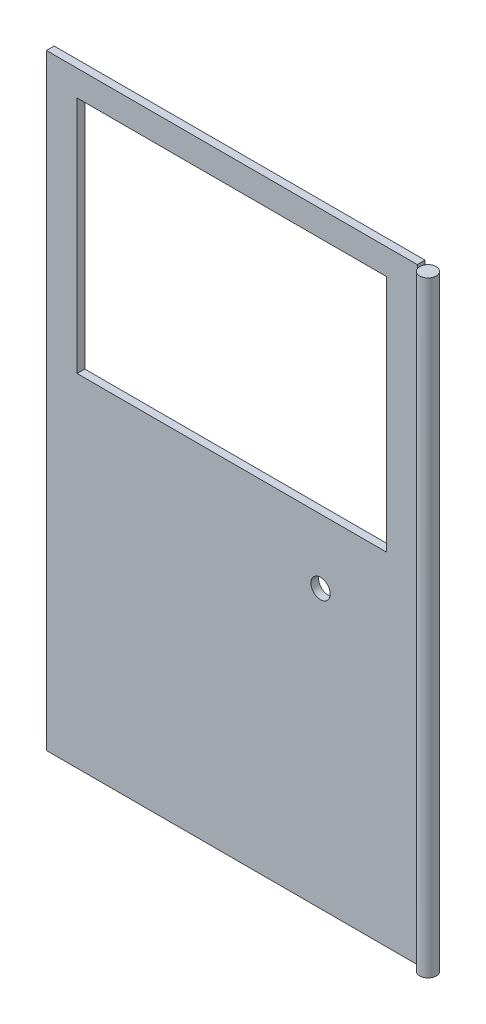
ISO-10303-21;
HEADER;
FILE_DESCRIPTION(('STEP AP214'),'2;1');
FILE_NAME('part.step','',(''),(''),'','','');
FILE_SCHEMA(('AUTOMOTIVE_DESIGN { 1 0 10303 214 1 1 1 1 }'));
ENDSEC;
DATA;
#1=APPLICATION_CONTEXT('core data for automotive mechanical design processes');
#2=APPLICATION_PROTOCOL_DEFINITION('international standard','automotive_design',2000,#1);
#3=PRODUCT_CONTEXT('',#1,'mechanical');
#4=PRODUCT('Part','Part','',(#3));
#5=PRODUCT_RELATED_PRODUCT_CATEGORY('part','',(#4));
#6=PRODUCT_DEFINITION_FORMATION('','',#4);
#7=PRODUCT_DEFINITION_CONTEXT('part definition',#1,'design');
#8=PRODUCT_DEFINITION('design','',#6,#7);
#9=PRODUCT_DEFINITION_SHAPE('','',#8);
#10=(LENGTH_UNIT() NAMED_UNIT(*) SI_UNIT(.MILLI.,.METRE.));
#11=(NAMED_UNIT(*) PLANE_ANGLE_UNIT() SI_UNIT($,.RADIAN.));
#12=(NAMED_UNIT(*) SI_UNIT($,.STERADIAN.) SOLID_ANGLE_UNIT());
#13=UNCERTAINTY_MEASURE_WITH_UNIT(LENGTH_MEASURE(1.E-05),#10,'distance_accuracy_value','');
#14=(GEOMETRIC_REPRESENTATION_CONTEXT(3) GLOBAL_UNCERTAINTY_ASSIGNED_CONTEXT((#13)) GLOBAL_UNIT_ASSIGNED_CONTEXT((#10,
#11,#12)) REPRESENTATION_CONTEXT('',''));
#15=CARTESIAN_POINT('',(0.,0.,0.));
#16=DIRECTION('',(0.,0.,1.));
#17=DIRECTION('',(1.,0.,0.));
#18=AXIS2_PLACEMENT_3D('',#15,#16,#17);
#19=CARTESIAN_POINT('',(304.8,505.921024484277,12.7));
#20=DIRECTION('',(0.,-1.,0.));
#21=DIRECTION('',(0.,0.,-1.));
#22=AXIS2_PLACEMENT_3D('',#19,#20,#21);
#23=CYLINDRICAL_SURFACE('',#22,12.7);
#24=CARTESIAN_POINT('',(304.8,470.,12.7));
#25=DIRECTION('',(0.,-1.,0.));
#26=DIRECTION('',(0.,0.,-1.));
#27=AXIS2_PLACEMENT_3D('',#24,#25,#26);
#28=CIRCLE('',#27,12.7);
#29=CARTESIAN_POINT('',(304.8,470.,0.));
#30=VERTEX_POINT('',#29);
#31=EDGE_CURVE('E11',#30,#30,#28,.T.);
#32=ORIENTED_EDGE('',*,*,#31,.T.);
#33=EDGE_LOOP('',(#32));
#34=FACE_BOUND('',#33,.T.);
#35=CARTESIAN_POINT('',(304.8,-470.,12.7));
#36=DIRECTION('',(0.,1.,0.));
#37=DIRECTION('',(0.,0.,1.));
#38=AXIS2_PLACEMENT_3D('',#35,#36,#37);
#39=CIRCLE('',#38,12.7);
#40=CARTESIAN_POINT('',(304.8,-470.,25.4));
#41=VERTEX_POINT('',#40);
#42=EDGE_CURVE('E47',#41,#41,#39,.F.);
#43=ORIENTED_EDGE('',*,*,#42,.F.);
#44=EDGE_LOOP('',(#43));
#45=FACE_BOUND('',#44,.T.);
#46=ADVANCED_FACE('F41',(#34,#45),#23,.T.);
#47=CARTESIAN_POINT('',(-287.5,470.,12.));
#48=DIRECTION('',(0.,-1.,0.));
#49=DIRECTION('',(0.,0.,-1.));
#50=AXIS2_PLACEMENT_3D('',#47,#48,#49);
#51=PLANE('',#50);
#52=ORIENTED_EDGE('',*,*,#31,.F.);
#53=EDGE_LOOP('',(#52));
#54=FACE_BOUND('',#53,.T.);
#55=ADVANCED_FACE('F56',(#54),#51,.F.);
#56=CARTESIAN_POINT('',(-287.5,-470.,12.));
#57=DIRECTION('',(0.,1.,0.));
#58=DIRECTION('',(0.,0.,1.));
#59=AXIS2_PLACEMENT_3D('',#56,#57,#58);
#60=PLANE('',#59);
#61=ORIENTED_EDGE('',*,*,#42,.T.);
#62=EDGE_LOOP('',(#61));
#63=FACE_BOUND('',#62,.T.);
#64=ADVANCED_FACE('F53',(#63),#60,.F.);
#65=CLOSED_SHELL('',(#46,#55,#64));
#66=MANIFOLD_SOLID_BREP('B2',#65);
#67=CARTESIAN_POINT('',(0.,0.,12.));
#68=DIRECTION('',(0.,0.,1.));
#69=DIRECTION('',(1.,0.,0.));
#70=AXIS2_PLACEMENT_3D('',#67,#68,#69);
#71=PLANE('',#70);
#72=CARTESIAN_POINT('',(137.5,-39.9999999999998,12.));
#73=DIRECTION('',(0.,0.,1.));
#74=DIRECTION('',(1.,0.,0.));
#75=AXIS2_PLACEMENT_3D('',#72,#73,#74);
#76=CIRCLE('',#75,15.);
#77=CARTESIAN_POINT('',(152.5,-39.9999999999998,12.));
#78=VERTEX_POINT('',#77);
#79=EDGE_CURVE('E175',#78,#78,#76,.T.);
#80=ORIENTED_EDGE('',*,*,#79,.F.);
#81=EDGE_LOOP('',(#80));
#82=FACE_BOUND('',#81,.T.);
#83=DIRECTION('',(0.,1.,0.));
#84=VECTOR('',#83,1.);
#85=CARTESIAN_POINT('',(287.5,470.,12.));
#86=LINE('',#85,#84);
#87=CARTESIAN_POINT('',(287.5,-470.,12.));
#88=VERTEX_POINT('',#87);
#89=CARTESIAN_POINT('',(287.5,470.,12.));
#90=VERTEX_POINT('',#89);
#91=EDGE_CURVE('E185',#88,#90,#86,.T.);
#92=ORIENTED_EDGE('',*,*,#91,.T.);
#93=DIRECTION('',(-1.,0.,0.));
#94=VECTOR('',#93,1.);
#95=CARTESIAN_POINT('',(-287.5,470.,12.));
#96=LINE('',#95,#94);
#97=CARTESIAN_POINT('',(-287.5,470.,12.));
#98=VERTEX_POINT('',#97);
#99=EDGE_CURVE('E188',#90,#98,#96,.T.);
#100=ORIENTED_EDGE('',*,*,#99,.T.);
#101=DIRECTION('',(0.,-1.,0.));
#102=VECTOR('',#101,1.);
#103=CARTESIAN_POINT('',(-287.5,470.,12.));
#104=LINE('',#103,#102);
#105=CARTESIAN_POINT('',(-287.5,-470.,12.));
#106=VERTEX_POINT('',#105);
#107=EDGE_CURVE('E191',#98,#106,#104,.T.);
#108=ORIENTED_EDGE('',*,*,#107,.T.);
#109=DIRECTION('',(1.,0.,0.));
#110=VECTOR('',#109,1.);
#111=CARTESIAN_POINT('',(-287.5,-470.,12.));
#112=LINE('',#111,#110);
#113=EDGE_CURVE('E193',#106,#88,#112,.T.);
#114=ORIENTED_EDGE('',*,*,#113,.T.);
#115=EDGE_LOOP('',(#92,#100,#108,#114));
#116=FACE_BOUND('',#115,.T.);
#117=DIRECTION('',(1.,0.,0.));
#118=VECTOR('',#117,1.);
#119=CARTESIAN_POINT('',(240.,60.0000000000002,12.));
#120=LINE('',#119,#118);
#121=CARTESIAN_POINT('',(-240.,60.0000000000002,12.));
#122=VERTEX_POINT('',#121);
#123=CARTESIAN_POINT('',(240.,60.0000000000002,12.));
#124=VERTEX_POINT('',#123);
#125=EDGE_CURVE('E155',#122,#124,#120,.T.);
#126=ORIENTED_EDGE('',*,*,#125,.F.);
#127=DIRECTION('',(0.,-1.,0.));
#128=VECTOR('',#127,1.);
#129=CARTESIAN_POINT('',(-240.,60.0000000000002,12.));
#130=LINE('',#129,#128);
#131=CARTESIAN_POINT('',(-240.,430.,12.));
#132=VERTEX_POINT('',#131);
#133=EDGE_CURVE('E147',#132,#122,#130,.T.);
#134=ORIENTED_EDGE('',*,*,#133,.F.);
#135=DIRECTION('',(-1.,0.,0.));
#136=VECTOR('',#135,1.);
#137=CARTESIAN_POINT('',(240.,430.,12.));
#138=LINE('',#137,#136);
#139=CARTESIAN_POINT('',(240.,430.,12.));
#140=VERTEX_POINT('',#139);
#141=EDGE_CURVE('E169',#140,#132,#138,.T.);
#142=ORIENTED_EDGE('',*,*,#141,.F.);
#143=DIRECTION('',(0.,1.,0.));
#144=VECTOR('',#143,1.);
#145=CARTESIAN_POINT('',(240.,60.0000000000002,12.));
#146=LINE('',#145,#144);
#147=EDGE_CURVE('E167',#124,#140,#146,.T.);
#148=ORIENTED_EDGE('',*,*,#147,.F.);
#149=EDGE_LOOP('',(#126,#134,#142,#148));
#150=FACE_BOUND('',#149,.T.);
#151=ADVANCED_FACE('F82',(#82,#116,#150),#71,.T.);
#152=CARTESIAN_POINT('',(0.,0.,0.));
#153=DIRECTION('',(0.,0.,1.));
#154=DIRECTION('',(1.,0.,0.));
#155=AXIS2_PLACEMENT_3D('',#152,#153,#154);
#156=PLANE('',#155);
#157=CARTESIAN_POINT('',(137.5,-39.9999999999998,0.));
#158=DIRECTION('',(0.,0.,-1.));
#159=DIRECTION('',(-1.,0.,0.));
#160=AXIS2_PLACEMENT_3D('',#157,#158,#159);
#161=CIRCLE('',#160,15.);
#162=CARTESIAN_POINT('',(122.5,-39.9999999999998,0.));
#163=VERTEX_POINT('',#162);
#164=EDGE_CURVE('E273',#163,#163,#161,.T.);
#165=ORIENTED_EDGE('',*,*,#164,.F.);
#166=EDGE_LOOP('',(#165));
#167=FACE_BOUND('',#166,.T.);
#168=DIRECTION('',(0.,1.,0.));
#169=VECTOR('',#168,1.);
#170=CARTESIAN_POINT('',(287.5,470.,0.));
#171=LINE('',#170,#169);
#172=CARTESIAN_POINT('',(287.5,-470.,0.));
#173=VERTEX_POINT('',#172);
#174=CARTESIAN_POINT('',(287.5,470.,0.));
#175=VERTEX_POINT('',#174);
#176=EDGE_CURVE('E163',#173,#175,#171,.T.);
#177=ORIENTED_EDGE('',*,*,#176,.F.);
#178=DIRECTION('',(1.,0.,0.));
#179=VECTOR('',#178,1.);
#180=CARTESIAN_POINT('',(-287.5,-470.,0.));
#181=LINE('',#180,#179);
#182=CARTESIAN_POINT('',(-287.5,-470.,0.));
#183=VERTEX_POINT('',#182);
#184=EDGE_CURVE('E189',#183,#173,#181,.T.);
#185=ORIENTED_EDGE('',*,*,#184,.F.);
#186=DIRECTION('',(0.,-1.,0.));
#187=VECTOR('',#186,1.);
#188=CARTESIAN_POINT('',(-287.5,470.,0.));
#189=LINE('',#188,#187);
#190=CARTESIAN_POINT('',(-287.5,470.,0.));
#191=VERTEX_POINT('',#190);
#192=EDGE_CURVE('E200',#191,#183,#189,.T.);
#193=ORIENTED_EDGE('',*,*,#192,.F.);
#194=DIRECTION('',(-1.,0.,0.));
#195=VECTOR('',#194,1.);
#196=CARTESIAN_POINT('',(-287.5,470.,0.));
#197=LINE('',#196,#195);
#198=EDGE_CURVE('E198',#175,#191,#197,.T.);
#199=ORIENTED_EDGE('',*,*,#198,.F.);
#200=EDGE_LOOP('',(#177,#185,#193,#199));
#201=FACE_BOUND('',#200,.T.);
#202=DIRECTION('',(0.,-1.,0.));
#203=VECTOR('',#202,1.);
#204=CARTESIAN_POINT('',(-240.,60.0000000000002,0.));
#205=LINE('',#204,#203);
#206=CARTESIAN_POINT('',(-240.,430.,0.));
#207=VERTEX_POINT('',#206);
#208=CARTESIAN_POINT('',(-240.,60.0000000000002,0.));
#209=VERTEX_POINT('',#208);
#210=EDGE_CURVE('E105',#207,#209,#205,.T.);
#211=ORIENTED_EDGE('',*,*,#210,.T.);
#212=DIRECTION('',(1.,0.,0.));
#213=VECTOR('',#212,1.);
#214=CARTESIAN_POINT('',(240.,60.0000000000002,0.));
#215=LINE('',#214,#213);
#216=CARTESIAN_POINT('',(240.,60.0000000000002,0.));
#217=VERTEX_POINT('',#216);
#218=EDGE_CURVE('E162',#209,#217,#215,.T.);
#219=ORIENTED_EDGE('',*,*,#218,.T.);
#220=DIRECTION('',(0.,1.,0.));
#221=VECTOR('',#220,1.);
#222=CARTESIAN_POINT('',(240.,60.0000000000002,0.));
#223=LINE('',#222,#221);
#224=CARTESIAN_POINT('',(240.,430.,0.));
#225=VERTEX_POINT('',#224);
#226=EDGE_CURVE('E177',#217,#225,#223,.T.);
#227=ORIENTED_EDGE('',*,*,#226,.T.);
#228=DIRECTION('',(-1.,0.,0.));
#229=VECTOR('',#228,1.);
#230=CARTESIAN_POINT('',(240.,430.,0.));
#231=LINE('',#230,#229);
#232=EDGE_CURVE('E156',#225,#207,#231,.T.);
#233=ORIENTED_EDGE('',*,*,#232,.T.);
#234=EDGE_LOOP('',(#211,#219,#227,#233));
#235=FACE_BOUND('',#234,.T.);
#236=ADVANCED_FACE('F218',(#167,#201,#235),#156,.F.);
#237=CARTESIAN_POINT('',(287.5,470.,12.));
#238=DIRECTION('',(-1.,0.,0.));
#239=DIRECTION('',(0.,-1.,0.));
#240=AXIS2_PLACEMENT_3D('',#237,#238,#239);
#241=PLANE('',#240);
#242=ORIENTED_EDGE('',*,*,#176,.T.);
#243=DIRECTION('',(0.,0.,-1.));
#244=VECTOR('',#243,1.);
#245=CARTESIAN_POINT('',(287.5,470.,12.));
#246=LINE('',#245,#244);
#247=EDGE_CURVE('E39',#90,#175,#246,.T.);
#248=ORIENTED_EDGE('',*,*,#247,.F.);
#249=ORIENTED_EDGE('',*,*,#91,.F.);
#250=DIRECTION('',(0.,0.,-1.));
#251=VECTOR('',#250,1.);
#252=CARTESIAN_POINT('',(287.5,-470.,12.));
#253=LINE('',#252,#251);
#254=EDGE_CURVE('E195',#88,#173,#253,.T.);
#255=ORIENTED_EDGE('',*,*,#254,.T.);
#256=EDGE_LOOP('',(#242,#248,#249,#255));
#257=FACE_BOUND('',#256,.T.);
#258=ADVANCED_FACE('F84',(#257),#241,.F.);
#259=CARTESIAN_POINT('',(-287.5,470.,12.));
#260=DIRECTION('',(0.,-1.,0.));
#261=DIRECTION('',(0.,0.,-1.));
#262=AXIS2_PLACEMENT_3D('',#259,#260,#261);
#263=PLANE('',#262);
#264=ORIENTED_EDGE('',*,*,#198,.T.);
#265=DIRECTION('',(0.,0.,-1.));
#266=VECTOR('',#265,1.);
#267=CARTESIAN_POINT('',(-287.5,470.,12.));
#268=LINE('',#267,#266);
#269=EDGE_CURVE('E90',#98,#191,#268,.T.);
#270=ORIENTED_EDGE('',*,*,#269,.F.);
#271=ORIENTED_EDGE('',*,*,#99,.F.);
#272=ORIENTED_EDGE('',*,*,#247,.T.);
#273=EDGE_LOOP('',(#264,#270,#271,#272));
#274=FACE_BOUND('',#273,.T.);
#275=ADVANCED_FACE('F228',(#274),#263,.F.);
#276=CARTESIAN_POINT('',(-287.5,470.,12.));
#277=DIRECTION('',(1.,0.,0.));
#278=DIRECTION('',(0.,1.,0.));
#279=AXIS2_PLACEMENT_3D('',#276,#277,#278);
#280=PLANE('',#279);
#281=ORIENTED_EDGE('',*,*,#192,.T.);
#282=DIRECTION('',(0.,0.,-1.));
#283=VECTOR('',#282,1.);
#284=CARTESIAN_POINT('',(-287.5,-470.,12.));
#285=LINE('',#284,#283);
#286=EDGE_CURVE('E205',#106,#183,#285,.T.);
#287=ORIENTED_EDGE('',*,*,#286,.F.);
#288=ORIENTED_EDGE('',*,*,#107,.F.);
#289=ORIENTED_EDGE('',*,*,#269,.T.);
#290=EDGE_LOOP('',(#281,#287,#288,#289));
#291=FACE_BOUND('',#290,.T.);
#292=ADVANCED_FACE('F212',(#291),#280,.F.);
#293=CARTESIAN_POINT('',(-287.5,-470.,12.));
#294=DIRECTION('',(0.,1.,0.));
#295=DIRECTION('',(0.,0.,1.));
#296=AXIS2_PLACEMENT_3D('',#293,#294,#295);
#297=PLANE('',#296);
#298=ORIENTED_EDGE('',*,*,#184,.T.);
#299=ORIENTED_EDGE('',*,*,#254,.F.);
#300=ORIENTED_EDGE('',*,*,#113,.F.);
#301=ORIENTED_EDGE('',*,*,#286,.T.);
#302=EDGE_LOOP('',(#298,#299,#300,#301));
#303=FACE_BOUND('',#302,.T.);
#304=ADVANCED_FACE('F222',(#303),#297,.F.);
#305=CARTESIAN_POINT('',(-240.,60.0000000000002,12.));
#306=DIRECTION('',(1.,0.,0.));
#307=DIRECTION('',(0.,0.,-1.));
#308=AXIS2_PLACEMENT_3D('',#305,#306,#307);
#309=PLANE('',#308);
#310=ORIENTED_EDGE('',*,*,#210,.F.);
#311=DIRECTION('',(0.,0.,-1.));
#312=VECTOR('',#311,1.);
#313=CARTESIAN_POINT('',(-240.,430.,12.));
#314=LINE('',#313,#312);
#315=EDGE_CURVE('E151',#132,#207,#314,.T.);
#316=ORIENTED_EDGE('',*,*,#315,.F.);
#317=ORIENTED_EDGE('',*,*,#133,.T.);
#318=DIRECTION('',(0.,0.,-1.));
#319=VECTOR('',#318,1.);
#320=CARTESIAN_POINT('',(-240.,60.0000000000002,12.));
#321=LINE('',#320,#319);
#322=EDGE_CURVE('E150',#122,#209,#321,.T.);
#323=ORIENTED_EDGE('',*,*,#322,.T.);
#324=EDGE_LOOP('',(#310,#316,#317,#323));
#325=FACE_BOUND('',#324,.T.);
#326=ADVANCED_FACE('F149',(#325),#309,.T.);
#327=CARTESIAN_POINT('',(240.,60.0000000000002,12.));
#328=DIRECTION('',(0.,1.,0.));
#329=DIRECTION('',(-1.,0.,0.));
#330=AXIS2_PLACEMENT_3D('',#327,#328,#329);
#331=PLANE('',#330);
#332=ORIENTED_EDGE('',*,*,#218,.F.);
#333=ORIENTED_EDGE('',*,*,#322,.F.);
#334=ORIENTED_EDGE('',*,*,#125,.T.);
#335=DIRECTION('',(0.,0.,-1.));
#336=VECTOR('',#335,1.);
#337=CARTESIAN_POINT('',(240.,60.0000000000002,12.));
#338=LINE('',#337,#336);
#339=EDGE_CURVE('E164',#124,#217,#338,.T.);
#340=ORIENTED_EDGE('',*,*,#339,.T.);
#341=EDGE_LOOP('',(#332,#333,#334,#340));
#342=FACE_BOUND('',#341,.T.);
#343=ADVANCED_FACE('F159',(#342),#331,.T.);
#344=CARTESIAN_POINT('',(240.,60.0000000000002,12.));
#345=DIRECTION('',(-1.,0.,0.));
#346=DIRECTION('',(0.,0.,1.));
#347=AXIS2_PLACEMENT_3D('',#344,#345,#346);
#348=PLANE('',#347);
#349=ORIENTED_EDGE('',*,*,#226,.F.);
#350=ORIENTED_EDGE('',*,*,#339,.F.);
#351=ORIENTED_EDGE('',*,*,#147,.T.);
#352=DIRECTION('',(0.,0.,-1.));
#353=VECTOR('',#352,1.);
#354=CARTESIAN_POINT('',(240.,430.,12.));
#355=LINE('',#354,#353);
#356=EDGE_CURVE('E97',#140,#225,#355,.T.);
#357=ORIENTED_EDGE('',*,*,#356,.T.);
#358=EDGE_LOOP('',(#349,#350,#351,#357));
#359=FACE_BOUND('',#358,.T.);
#360=ADVANCED_FACE('F254',(#359),#348,.T.);
#361=CARTESIAN_POINT('',(240.,430.,12.));
#362=DIRECTION('',(0.,-1.,0.));
#363=DIRECTION('',(1.,0.,0.));
#364=AXIS2_PLACEMENT_3D('',#361,#362,#363);
#365=PLANE('',#364);
#366=ORIENTED_EDGE('',*,*,#232,.F.);
#367=ORIENTED_EDGE('',*,*,#356,.F.);
#368=ORIENTED_EDGE('',*,*,#141,.T.);
#369=ORIENTED_EDGE('',*,*,#315,.T.);
#370=EDGE_LOOP('',(#366,#367,#368,#369));
#371=FACE_BOUND('',#370,.T.);
#372=ADVANCED_FACE('F258',(#371),#365,.T.);
#373=CARTESIAN_POINT('',(137.5,-39.9999999999998,25.4));
#374=DIRECTION('',(0.,0.,-1.));
#375=DIRECTION('',(-1.,0.,0.));
#376=AXIS2_PLACEMENT_3D('',#373,#374,#375);
#377=CYLINDRICAL_SURFACE('',#376,15.);
#378=ORIENTED_EDGE('',*,*,#79,.T.);
#379=EDGE_LOOP('',(#378));
#380=FACE_BOUND('',#379,.T.);
#381=ORIENTED_EDGE('',*,*,#164,.T.);
#382=EDGE_LOOP('',(#381));
#383=FACE_BOUND('',#382,.T.);
#384=ADVANCED_FACE('F264',(#380,#383),#377,.F.);
#385=CLOSED_SHELL('',(#151,#236,#258,#275,#292,#304,#326,#343,#360,#372,#384));
#386=MANIFOLD_SOLID_BREP('B6',#385);
#387=ADVANCED_BREP_SHAPE_REPRESENTATION('',(#18,#66,#386),#14);
#388=SHAPE_DEFINITION_REPRESENTATION(#9,#387);
ENDSEC;
END-ISO-10303-21;
